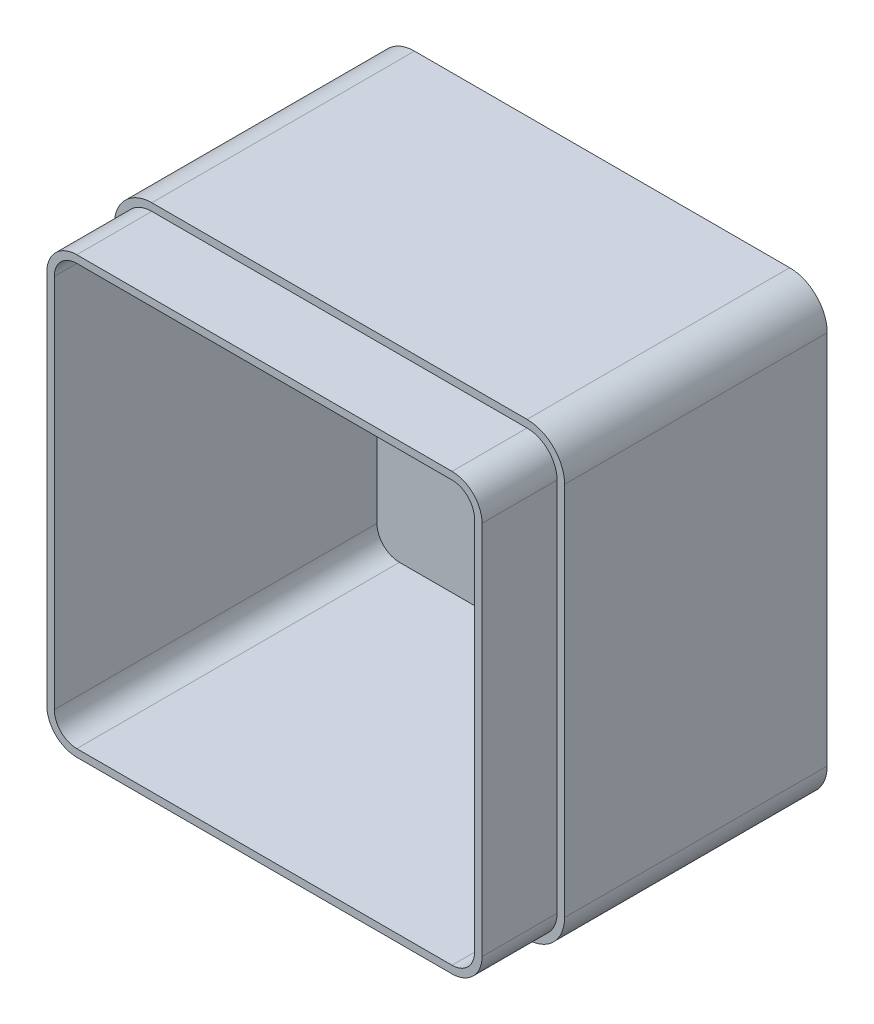
ISO-10303-21;
HEADER;
FILE_DESCRIPTION(('STEP AP214'),'2;1');
FILE_NAME('part.step','',(''),(''),'','','');
FILE_SCHEMA(('AUTOMOTIVE_DESIGN { 1 0 10303 214 1 1 1 1 }'));
ENDSEC;
DATA;
#1=APPLICATION_CONTEXT('core data for automotive mechanical design processes');
#2=APPLICATION_PROTOCOL_DEFINITION('international standard','automotive_design',2000,#1);
#3=PRODUCT_CONTEXT('',#1,'mechanical');
#4=PRODUCT('Part','Part','',(#3));
#5=PRODUCT_RELATED_PRODUCT_CATEGORY('part','',(#4));
#6=PRODUCT_DEFINITION_FORMATION('','',#4);
#7=PRODUCT_DEFINITION_CONTEXT('part definition',#1,'design');
#8=PRODUCT_DEFINITION('design','',#6,#7);
#9=PRODUCT_DEFINITION_SHAPE('','',#8);
#10=(LENGTH_UNIT() NAMED_UNIT(*) SI_UNIT(.MILLI.,.METRE.));
#11=(NAMED_UNIT(*) PLANE_ANGLE_UNIT() SI_UNIT($,.RADIAN.));
#12=(NAMED_UNIT(*) SI_UNIT($,.STERADIAN.) SOLID_ANGLE_UNIT());
#13=UNCERTAINTY_MEASURE_WITH_UNIT(LENGTH_MEASURE(1.E-05),#10,'distance_accuracy_value','');
#14=(GEOMETRIC_REPRESENTATION_CONTEXT(3) GLOBAL_UNCERTAINTY_ASSIGNED_CONTEXT((#13)) GLOBAL_UNIT_ASSIGNED_CONTEXT((#10,
#11,#12)) REPRESENTATION_CONTEXT('',''));
#15=CARTESIAN_POINT('',(0.,0.,0.));
#16=DIRECTION('',(0.,0.,1.));
#17=DIRECTION('',(1.,0.,0.));
#18=AXIS2_PLACEMENT_3D('',#15,#16,#17);
#19=CARTESIAN_POINT('',(0.,0.,90.));
#20=DIRECTION('',(0.,0.,-1.));
#21=DIRECTION('',(-1.,0.,0.));
#22=AXIS2_PLACEMENT_3D('',#19,#20,#21);
#23=PLANE('',#22);
#24=DIRECTION('',(0.,-1.,0.));
#25=VECTOR('',#24,1.);
#26=CARTESIAN_POINT('',(4.,0.,90.));
#27=LINE('',#26,#25);
#28=CARTESIAN_POINT('',(4.,110.,90.));
#29=VERTEX_POINT('',#28);
#30=CARTESIAN_POINT('',(4.,9.99999999999999,90.));
#31=VERTEX_POINT('',#30);
#32=EDGE_CURVE('E350',#29,#31,#27,.T.);
#33=ORIENTED_EDGE('',*,*,#32,.F.);
#34=CARTESIAN_POINT('',(10.,110.,90.));
#35=DIRECTION('',(0.,0.,-1.));
#36=DIRECTION('',(-1.,0.,0.));
#37=AXIS2_PLACEMENT_3D('',#34,#35,#36);
#38=CIRCLE('',#37,6.);
#39=CARTESIAN_POINT('',(9.99999999999999,116.,90.));
#40=VERTEX_POINT('',#39);
#41=EDGE_CURVE('E328',#40,#29,#38,.F.);
#42=ORIENTED_EDGE('',*,*,#41,.F.);
#43=DIRECTION('',(-1.,0.,0.));
#44=VECTOR('',#43,1.);
#45=CARTESIAN_POINT('',(0.,116.,90.));
#46=LINE('',#45,#44);
#47=CARTESIAN_POINT('',(110.,116.,90.));
#48=VERTEX_POINT('',#47);
#49=EDGE_CURVE('E364',#48,#40,#46,.T.);
#50=ORIENTED_EDGE('',*,*,#49,.F.);
#51=CARTESIAN_POINT('',(110.,110.,90.));
#52=DIRECTION('',(0.,0.,-1.));
#53=DIRECTION('',(-1.,0.,0.));
#54=AXIS2_PLACEMENT_3D('',#51,#52,#53);
#55=CIRCLE('',#54,6.);
#56=CARTESIAN_POINT('',(116.,110.,90.));
#57=VERTEX_POINT('',#56);
#58=EDGE_CURVE('E388',#57,#48,#55,.F.);
#59=ORIENTED_EDGE('',*,*,#58,.F.);
#60=DIRECTION('',(0.,1.,0.));
#61=VECTOR('',#60,1.);
#62=CARTESIAN_POINT('',(116.,0.,90.));
#63=LINE('',#62,#61);
#64=CARTESIAN_POINT('',(116.,9.99999999999999,90.));
#65=VERTEX_POINT('',#64);
#66=EDGE_CURVE('E392',#65,#57,#63,.T.);
#67=ORIENTED_EDGE('',*,*,#66,.F.);
#68=CARTESIAN_POINT('',(110.,10.,90.));
#69=DIRECTION('',(0.,0.,-1.));
#70=DIRECTION('',(-1.,0.,0.));
#71=AXIS2_PLACEMENT_3D('',#68,#69,#70);
#72=CIRCLE('',#71,6.);
#73=CARTESIAN_POINT('',(110.,4.,90.));
#74=VERTEX_POINT('',#73);
#75=EDGE_CURVE('E393',#74,#65,#72,.F.);
#76=ORIENTED_EDGE('',*,*,#75,.F.);
#77=DIRECTION('',(1.,0.,0.));
#78=VECTOR('',#77,1.);
#79=CARTESIAN_POINT('',(0.,4.,90.));
#80=LINE('',#79,#78);
#81=CARTESIAN_POINT('',(9.99999999999999,4.,90.));
#82=VERTEX_POINT('',#81);
#83=EDGE_CURVE('E385',#82,#74,#80,.T.);
#84=ORIENTED_EDGE('',*,*,#83,.F.);
#85=CARTESIAN_POINT('',(10.,10.,90.));
#86=DIRECTION('',(0.,0.,-1.));
#87=DIRECTION('',(-1.,0.,0.));
#88=AXIS2_PLACEMENT_3D('',#85,#86,#87);
#89=CIRCLE('',#88,6.);
#90=EDGE_CURVE('E381',#31,#82,#89,.F.);
#91=ORIENTED_EDGE('',*,*,#90,.F.);
#92=EDGE_LOOP('',(#33,#42,#50,#59,#67,#76,#84,#91));
#93=FACE_BOUND('',#92,.T.);
#94=CARTESIAN_POINT('',(10.,110.,90.));
#95=DIRECTION('',(0.,0.,1.));
#96=DIRECTION('',(1.,0.,0.));
#97=AXIS2_PLACEMENT_3D('',#94,#95,#96);
#98=CIRCLE('',#97,8.);
#99=CARTESIAN_POINT('',(9.99999999999999,118.,90.));
#100=VERTEX_POINT('',#99);
#101=CARTESIAN_POINT('',(2.,110.,90.));
#102=VERTEX_POINT('',#101);
#103=EDGE_CURVE('E256',#100,#102,#98,.T.);
#104=ORIENTED_EDGE('',*,*,#103,.T.);
#105=DIRECTION('',(0.,-1.,0.));
#106=VECTOR('',#105,1.);
#107=CARTESIAN_POINT('',(2.,110.,90.));
#108=LINE('',#107,#106);
#109=CARTESIAN_POINT('',(2.,9.99999999999999,90.));
#110=VERTEX_POINT('',#109);
#111=EDGE_CURVE('E206',#102,#110,#108,.T.);
#112=ORIENTED_EDGE('',*,*,#111,.T.);
#113=CARTESIAN_POINT('',(10.,10.,90.));
#114=DIRECTION('',(0.,0.,1.));
#115=DIRECTION('',(1.,0.,0.));
#116=AXIS2_PLACEMENT_3D('',#113,#114,#115);
#117=CIRCLE('',#116,8.);
#118=CARTESIAN_POINT('',(9.99999999999999,2.,90.));
#119=VERTEX_POINT('',#118);
#120=EDGE_CURVE('E55',#110,#119,#117,.T.);
#121=ORIENTED_EDGE('',*,*,#120,.T.);
#122=DIRECTION('',(1.,0.,0.));
#123=VECTOR('',#122,1.);
#124=CARTESIAN_POINT('',(10.,2.,90.));
#125=LINE('',#124,#123);
#126=CARTESIAN_POINT('',(110.,2.,90.));
#127=VERTEX_POINT('',#126);
#128=EDGE_CURVE('E263',#119,#127,#125,.T.);
#129=ORIENTED_EDGE('',*,*,#128,.T.);
#130=CARTESIAN_POINT('',(110.,10.,90.));
#131=DIRECTION('',(0.,0.,1.));
#132=DIRECTION('',(1.,0.,0.));
#133=AXIS2_PLACEMENT_3D('',#130,#131,#132);
#134=CIRCLE('',#133,7.99999999999999);
#135=CARTESIAN_POINT('',(118.,10.,90.));
#136=VERTEX_POINT('',#135);
#137=EDGE_CURVE('E267',#127,#136,#134,.T.);
#138=ORIENTED_EDGE('',*,*,#137,.T.);
#139=DIRECTION('',(0.,1.,0.));
#140=VECTOR('',#139,1.);
#141=CARTESIAN_POINT('',(118.,10.,90.));
#142=LINE('',#141,#140);
#143=CARTESIAN_POINT('',(118.,110.,90.));
#144=VERTEX_POINT('',#143);
#145=EDGE_CURVE('E271',#136,#144,#142,.T.);
#146=ORIENTED_EDGE('',*,*,#145,.T.);
#147=CARTESIAN_POINT('',(110.,110.,90.));
#148=DIRECTION('',(0.,0.,1.));
#149=DIRECTION('',(1.,0.,0.));
#150=AXIS2_PLACEMENT_3D('',#147,#148,#149);
#151=CIRCLE('',#150,7.99999999999999);
#152=CARTESIAN_POINT('',(110.,118.,90.));
#153=VERTEX_POINT('',#152);
#154=EDGE_CURVE('E233',#144,#153,#151,.T.);
#155=ORIENTED_EDGE('',*,*,#154,.T.);
#156=DIRECTION('',(-1.,0.,0.));
#157=VECTOR('',#156,1.);
#158=CARTESIAN_POINT('',(110.,118.,90.));
#159=LINE('',#158,#157);
#160=EDGE_CURVE('E229',#153,#100,#159,.T.);
#161=ORIENTED_EDGE('',*,*,#160,.T.);
#162=EDGE_LOOP('',(#104,#112,#121,#129,#138,#146,#155,#161));
#163=FACE_BOUND('',#162,.T.);
#164=ADVANCED_FACE('F39',(#93,#163),#23,.F.);
#165=CARTESIAN_POINT('',(4.,0.,90.));
#166=DIRECTION('',(1.,0.,0.));
#167=DIRECTION('',(0.,0.,-1.));
#168=AXIS2_PLACEMENT_3D('',#165,#166,#167);
#169=PLANE('',#168);
#170=DIRECTION('',(0.,-1.,0.));
#171=VECTOR('',#170,1.);
#172=CARTESIAN_POINT('',(4.,0.,4.));
#173=LINE('',#172,#171);
#174=CARTESIAN_POINT('',(4.,110.,4.));
#175=VERTEX_POINT('',#174);
#176=CARTESIAN_POINT('',(4.,9.99999999999999,4.));
#177=VERTEX_POINT('',#176);
#178=EDGE_CURVE('E320',#175,#177,#173,.T.);
#179=ORIENTED_EDGE('',*,*,#178,.F.);
#180=DIRECTION('',(0.,0.,-1.));
#181=VECTOR('',#180,1.);
#182=CARTESIAN_POINT('',(4.,110.,90.));
#183=LINE('',#182,#181);
#184=EDGE_CURVE('E329',#29,#175,#183,.T.);
#185=ORIENTED_EDGE('',*,*,#184,.F.);
#186=ORIENTED_EDGE('',*,*,#32,.T.);
#187=DIRECTION('',(0.,0.,-1.));
#188=VECTOR('',#187,1.);
#189=CARTESIAN_POINT('',(4.,9.99999999999999,90.));
#190=LINE('',#189,#188);
#191=EDGE_CURVE('E325',#177,#31,#190,.F.);
#192=ORIENTED_EDGE('',*,*,#191,.F.);
#193=EDGE_LOOP('',(#179,#185,#186,#192));
#194=FACE_BOUND('',#193,.T.);
#195=ADVANCED_FACE('F505',(#194),#169,.T.);
#196=CARTESIAN_POINT('',(0.,4.,90.));
#197=DIRECTION('',(0.,1.,0.));
#198=DIRECTION('',(0.,0.,1.));
#199=AXIS2_PLACEMENT_3D('',#196,#197,#198);
#200=PLANE('',#199);
#201=ORIENTED_EDGE('',*,*,#83,.T.);
#202=DIRECTION('',(0.,0.,1.));
#203=VECTOR('',#202,1.);
#204=CARTESIAN_POINT('',(110.,4.,90.));
#205=LINE('',#204,#203);
#206=CARTESIAN_POINT('',(110.,4.,4.));
#207=VERTEX_POINT('',#206);
#208=EDGE_CURVE('E361',#207,#74,#205,.T.);
#209=ORIENTED_EDGE('',*,*,#208,.F.);
#210=DIRECTION('',(1.,0.,0.));
#211=VECTOR('',#210,1.);
#212=CARTESIAN_POINT('',(0.,4.,4.));
#213=LINE('',#212,#211);
#214=CARTESIAN_POINT('',(9.99999999999999,4.,4.));
#215=VERTEX_POINT('',#214);
#216=EDGE_CURVE('E324',#215,#207,#213,.T.);
#217=ORIENTED_EDGE('',*,*,#216,.F.);
#218=DIRECTION('',(0.,0.,1.));
#219=VECTOR('',#218,1.);
#220=CARTESIAN_POINT('',(9.99999999999999,4.,90.));
#221=LINE('',#220,#219);
#222=EDGE_CURVE('E345',#82,#215,#221,.F.);
#223=ORIENTED_EDGE('',*,*,#222,.F.);
#224=EDGE_LOOP('',(#201,#209,#217,#223));
#225=FACE_BOUND('',#224,.T.);
#226=ADVANCED_FACE('F511',(#225),#200,.T.);
#227=CARTESIAN_POINT('',(116.,0.,90.));
#228=DIRECTION('',(-1.,0.,0.));
#229=DIRECTION('',(0.,0.,1.));
#230=AXIS2_PLACEMENT_3D('',#227,#228,#229);
#231=PLANE('',#230);
#232=DIRECTION('',(0.,1.,0.));
#233=VECTOR('',#232,1.);
#234=CARTESIAN_POINT('',(116.,0.,4.));
#235=LINE('',#234,#233);
#236=CARTESIAN_POINT('',(116.,9.99999999999999,4.));
#237=VERTEX_POINT('',#236);
#238=CARTESIAN_POINT('',(116.,110.,4.));
#239=VERTEX_POINT('',#238);
#240=EDGE_CURVE('E337',#237,#239,#235,.T.);
#241=ORIENTED_EDGE('',*,*,#240,.F.);
#242=DIRECTION('',(0.,0.,1.));
#243=VECTOR('',#242,1.);
#244=CARTESIAN_POINT('',(116.,9.99999999999999,90.));
#245=LINE('',#244,#243);
#246=EDGE_CURVE('E365',#65,#237,#245,.F.);
#247=ORIENTED_EDGE('',*,*,#246,.F.);
#248=ORIENTED_EDGE('',*,*,#66,.T.);
#249=DIRECTION('',(0.,0.,1.));
#250=VECTOR('',#249,1.);
#251=CARTESIAN_POINT('',(116.,110.,90.));
#252=LINE('',#251,#250);
#253=EDGE_CURVE('E369',#239,#57,#252,.T.);
#254=ORIENTED_EDGE('',*,*,#253,.F.);
#255=EDGE_LOOP('',(#241,#247,#248,#254));
#256=FACE_BOUND('',#255,.T.);
#257=ADVANCED_FACE('F540',(#256),#231,.T.);
#258=CARTESIAN_POINT('',(0.,116.,90.));
#259=DIRECTION('',(0.,-1.,0.));
#260=DIRECTION('',(0.,0.,-1.));
#261=AXIS2_PLACEMENT_3D('',#258,#259,#260);
#262=PLANE('',#261);
#263=ORIENTED_EDGE('',*,*,#49,.T.);
#264=DIRECTION('',(0.,0.,-1.));
#265=VECTOR('',#264,1.);
#266=CARTESIAN_POINT('',(9.99999999999999,116.,90.));
#267=LINE('',#266,#265);
#268=CARTESIAN_POINT('',(9.99999999999999,116.,4.));
#269=VERTEX_POINT('',#268);
#270=EDGE_CURVE('E377',#269,#40,#267,.F.);
#271=ORIENTED_EDGE('',*,*,#270,.F.);
#272=DIRECTION('',(-1.,0.,0.));
#273=VECTOR('',#272,1.);
#274=CARTESIAN_POINT('',(0.,116.,4.));
#275=LINE('',#274,#273);
#276=CARTESIAN_POINT('',(110.,116.,4.));
#277=VERTEX_POINT('',#276);
#278=EDGE_CURVE('E346',#277,#269,#275,.T.);
#279=ORIENTED_EDGE('',*,*,#278,.F.);
#280=DIRECTION('',(0.,0.,-1.));
#281=VECTOR('',#280,1.);
#282=CARTESIAN_POINT('',(110.,116.,90.));
#283=LINE('',#282,#281);
#284=EDGE_CURVE('E370',#48,#277,#283,.T.);
#285=ORIENTED_EDGE('',*,*,#284,.F.);
#286=EDGE_LOOP('',(#263,#271,#279,#285));
#287=FACE_BOUND('',#286,.T.);
#288=ADVANCED_FACE('F536',(#287),#262,.T.);
#289=CARTESIAN_POINT('',(0.,0.,4.));
#290=DIRECTION('',(0.,0.,-1.));
#291=DIRECTION('',(-1.,0.,0.));
#292=AXIS2_PLACEMENT_3D('',#289,#290,#291);
#293=PLANE('',#292);
#294=ORIENTED_EDGE('',*,*,#216,.T.);
#295=CARTESIAN_POINT('',(110.,10.,4.));
#296=DIRECTION('',(0.,0.,-1.));
#297=DIRECTION('',(-1.,0.,0.));
#298=AXIS2_PLACEMENT_3D('',#295,#296,#297);
#299=CIRCLE('',#298,6.);
#300=EDGE_CURVE('E344',#237,#207,#299,.T.);
#301=ORIENTED_EDGE('',*,*,#300,.F.);
#302=ORIENTED_EDGE('',*,*,#240,.T.);
#303=CARTESIAN_POINT('',(110.,110.,4.));
#304=DIRECTION('',(0.,0.,-1.));
#305=DIRECTION('',(-1.,0.,0.));
#306=AXIS2_PLACEMENT_3D('',#303,#304,#305);
#307=CIRCLE('',#306,6.);
#308=EDGE_CURVE('E340',#277,#239,#307,.T.);
#309=ORIENTED_EDGE('',*,*,#308,.F.);
#310=ORIENTED_EDGE('',*,*,#278,.T.);
#311=CARTESIAN_POINT('',(10.,110.,4.));
#312=DIRECTION('',(0.,0.,-1.));
#313=DIRECTION('',(-1.,0.,0.));
#314=AXIS2_PLACEMENT_3D('',#311,#312,#313);
#315=CIRCLE('',#314,6.);
#316=EDGE_CURVE('E341',#175,#269,#315,.T.);
#317=ORIENTED_EDGE('',*,*,#316,.F.);
#318=ORIENTED_EDGE('',*,*,#178,.T.);
#319=CARTESIAN_POINT('',(10.,10.,4.));
#320=DIRECTION('',(0.,0.,-1.));
#321=DIRECTION('',(-1.,0.,0.));
#322=AXIS2_PLACEMENT_3D('',#319,#320,#321);
#323=CIRCLE('',#322,6.);
#324=EDGE_CURVE('E333',#215,#177,#323,.T.);
#325=ORIENTED_EDGE('',*,*,#324,.F.);
#326=EDGE_LOOP('',(#294,#301,#302,#309,#310,#317,#318,#325));
#327=FACE_BOUND('',#326,.T.);
#328=ADVANCED_FACE('F532',(#327),#293,.F.);
#329=CARTESIAN_POINT('',(10.,10.,90.));
#330=DIRECTION('',(0.,0.,-1.));
#331=DIRECTION('',(-1.,0.,0.));
#332=AXIS2_PLACEMENT_3D('',#329,#330,#331);
#333=CYLINDRICAL_SURFACE('',#332,6.);
#334=ORIENTED_EDGE('',*,*,#90,.T.);
#335=ORIENTED_EDGE('',*,*,#222,.T.);
#336=ORIENTED_EDGE('',*,*,#324,.T.);
#337=ORIENTED_EDGE('',*,*,#191,.T.);
#338=EDGE_LOOP('',(#334,#335,#336,#337));
#339=FACE_BOUND('',#338,.T.);
#340=ADVANCED_FACE('F528',(#339),#333,.F.);
#341=CARTESIAN_POINT('',(110.,110.,90.));
#342=DIRECTION('',(0.,0.,-1.));
#343=DIRECTION('',(-1.,0.,0.));
#344=AXIS2_PLACEMENT_3D('',#341,#342,#343);
#345=CYLINDRICAL_SURFACE('',#344,6.);
#346=ORIENTED_EDGE('',*,*,#58,.T.);
#347=ORIENTED_EDGE('',*,*,#284,.T.);
#348=ORIENTED_EDGE('',*,*,#308,.T.);
#349=ORIENTED_EDGE('',*,*,#253,.T.);
#350=EDGE_LOOP('',(#346,#347,#348,#349));
#351=FACE_BOUND('',#350,.T.);
#352=ADVANCED_FACE('F524',(#351),#345,.F.);
#353=CARTESIAN_POINT('',(110.,10.,90.));
#354=DIRECTION('',(0.,0.,-1.));
#355=DIRECTION('',(-1.,0.,0.));
#356=AXIS2_PLACEMENT_3D('',#353,#354,#355);
#357=CYLINDRICAL_SURFACE('',#356,6.);
#358=ORIENTED_EDGE('',*,*,#75,.T.);
#359=ORIENTED_EDGE('',*,*,#246,.T.);
#360=ORIENTED_EDGE('',*,*,#300,.T.);
#361=ORIENTED_EDGE('',*,*,#208,.T.);
#362=EDGE_LOOP('',(#358,#359,#360,#361));
#363=FACE_BOUND('',#362,.T.);
#364=ADVANCED_FACE('F520',(#363),#357,.F.);
#365=CARTESIAN_POINT('',(10.,110.,90.));
#366=DIRECTION('',(0.,0.,-1.));
#367=DIRECTION('',(-1.,0.,0.));
#368=AXIS2_PLACEMENT_3D('',#365,#366,#367);
#369=CYLINDRICAL_SURFACE('',#368,6.);
#370=ORIENTED_EDGE('',*,*,#41,.T.);
#371=ORIENTED_EDGE('',*,*,#184,.T.);
#372=ORIENTED_EDGE('',*,*,#316,.T.);
#373=ORIENTED_EDGE('',*,*,#270,.T.);
#374=EDGE_LOOP('',(#370,#371,#372,#373));
#375=FACE_BOUND('',#374,.T.);
#376=ADVANCED_FACE('F517',(#375),#369,.F.);
#377=CARTESIAN_POINT('',(60.,60.,70.));
#378=DIRECTION('',(0.,0.,1.));
#379=DIRECTION('',(1.,0.,0.));
#380=AXIS2_PLACEMENT_3D('',#377,#378,#379);
#381=PLANE('',#380);
#382=DIRECTION('',(0.,1.,0.));
#383=VECTOR('',#382,1.);
#384=CARTESIAN_POINT('',(120.,0.,70.));
#385=LINE('',#384,#383);
#386=CARTESIAN_POINT('',(120.,10.,70.));
#387=VERTEX_POINT('',#386);
#388=CARTESIAN_POINT('',(120.,110.,70.));
#389=VERTEX_POINT('',#388);
#390=EDGE_CURVE('E310',#387,#389,#385,.T.);
#391=ORIENTED_EDGE('',*,*,#390,.T.);
#392=CARTESIAN_POINT('',(110.,110.,70.));
#393=DIRECTION('',(0.,0.,1.));
#394=DIRECTION('',(1.,0.,0.));
#395=AXIS2_PLACEMENT_3D('',#392,#393,#394);
#396=CIRCLE('',#395,10.);
#397=CARTESIAN_POINT('',(110.,120.,70.));
#398=VERTEX_POINT('',#397);
#399=EDGE_CURVE('E302',#398,#389,#396,.F.);
#400=ORIENTED_EDGE('',*,*,#399,.F.);
#401=DIRECTION('',(-1.,0.,0.));
#402=VECTOR('',#401,1.);
#403=CARTESIAN_POINT('',(0.,120.,70.));
#404=LINE('',#403,#402);
#405=CARTESIAN_POINT('',(10.,120.,70.));
#406=VERTEX_POINT('',#405);
#407=EDGE_CURVE('E63',#398,#406,#404,.T.);
#408=ORIENTED_EDGE('',*,*,#407,.T.);
#409=CARTESIAN_POINT('',(10.,110.,70.));
#410=DIRECTION('',(0.,0.,1.));
#411=DIRECTION('',(1.,0.,0.));
#412=AXIS2_PLACEMENT_3D('',#409,#410,#411);
#413=CIRCLE('',#412,10.);
#414=CARTESIAN_POINT('',(0.,110.,70.));
#415=VERTEX_POINT('',#414);
#416=EDGE_CURVE('E12',#415,#406,#413,.F.);
#417=ORIENTED_EDGE('',*,*,#416,.F.);
#418=DIRECTION('',(0.,-1.,0.));
#419=VECTOR('',#418,1.);
#420=CARTESIAN_POINT('',(0.,0.,70.));
#421=LINE('',#420,#419);
#422=CARTESIAN_POINT('',(0.,10.,70.));
#423=VERTEX_POINT('',#422);
#424=EDGE_CURVE('E299',#415,#423,#421,.T.);
#425=ORIENTED_EDGE('',*,*,#424,.T.);
#426=CARTESIAN_POINT('',(10.,10.,70.));
#427=DIRECTION('',(0.,0.,1.));
#428=DIRECTION('',(1.,0.,0.));
#429=AXIS2_PLACEMENT_3D('',#426,#427,#428);
#430=CIRCLE('',#429,10.);
#431=CARTESIAN_POINT('',(10.,0.,70.));
#432=VERTEX_POINT('',#431);
#433=EDGE_CURVE('E306',#432,#423,#430,.F.);
#434=ORIENTED_EDGE('',*,*,#433,.F.);
#435=DIRECTION('',(1.,0.,0.));
#436=VECTOR('',#435,1.);
#437=CARTESIAN_POINT('',(0.,0.,70.));
#438=LINE('',#437,#436);
#439=CARTESIAN_POINT('',(110.,0.,70.));
#440=VERTEX_POINT('',#439);
#441=EDGE_CURVE('E313',#432,#440,#438,.T.);
#442=ORIENTED_EDGE('',*,*,#441,.T.);
#443=CARTESIAN_POINT('',(110.,10.,70.));
#444=DIRECTION('',(0.,0.,1.));
#445=DIRECTION('',(1.,0.,0.));
#446=AXIS2_PLACEMENT_3D('',#443,#444,#445);
#447=CIRCLE('',#446,10.);
#448=EDGE_CURVE('E316',#387,#440,#447,.F.);
#449=ORIENTED_EDGE('',*,*,#448,.F.);
#450=EDGE_LOOP('',(#391,#400,#408,#417,#425,#434,#442,#449));
#451=FACE_BOUND('',#450,.T.);
#452=DIRECTION('',(-1.,0.,0.));
#453=VECTOR('',#452,1.);
#454=CARTESIAN_POINT('',(110.,118.,70.));
#455=LINE('',#454,#453);
#456=CARTESIAN_POINT('',(110.,118.,70.));
#457=VERTEX_POINT('',#456);
#458=CARTESIAN_POINT('',(9.99999999999999,118.,70.));
#459=VERTEX_POINT('',#458);
#460=EDGE_CURVE('E213',#457,#459,#455,.T.);
#461=ORIENTED_EDGE('',*,*,#460,.F.);
#462=CARTESIAN_POINT('',(110.,110.,70.));
#463=DIRECTION('',(0.,0.,1.));
#464=DIRECTION('',(1.,0.,0.));
#465=AXIS2_PLACEMENT_3D('',#462,#463,#464);
#466=CIRCLE('',#465,7.99999999999999);
#467=CARTESIAN_POINT('',(118.,110.,70.));
#468=VERTEX_POINT('',#467);
#469=EDGE_CURVE('E250',#468,#457,#466,.T.);
#470=ORIENTED_EDGE('',*,*,#469,.F.);
#471=DIRECTION('',(0.,1.,0.));
#472=VECTOR('',#471,1.);
#473=CARTESIAN_POINT('',(118.,10.,70.));
#474=LINE('',#473,#472);
#475=CARTESIAN_POINT('',(118.,10.,70.));
#476=VERTEX_POINT('',#475);
#477=EDGE_CURVE('E246',#476,#468,#474,.T.);
#478=ORIENTED_EDGE('',*,*,#477,.F.);
#479=CARTESIAN_POINT('',(110.,10.,70.));
#480=DIRECTION('',(0.,0.,1.));
#481=DIRECTION('',(1.,0.,0.));
#482=AXIS2_PLACEMENT_3D('',#479,#480,#481);
#483=CIRCLE('',#482,7.99999999999999);
#484=CARTESIAN_POINT('',(110.,2.,70.));
#485=VERTEX_POINT('',#484);
#486=EDGE_CURVE('E242',#485,#476,#483,.T.);
#487=ORIENTED_EDGE('',*,*,#486,.F.);
#488=DIRECTION('',(1.,0.,0.));
#489=VECTOR('',#488,1.);
#490=CARTESIAN_POINT('',(10.,2.,70.));
#491=LINE('',#490,#489);
#492=CARTESIAN_POINT('',(9.99999999999999,2.,70.));
#493=VERTEX_POINT('',#492);
#494=EDGE_CURVE('E238',#493,#485,#491,.T.);
#495=ORIENTED_EDGE('',*,*,#494,.F.);
#496=CARTESIAN_POINT('',(10.,10.,70.));
#497=DIRECTION('',(0.,0.,1.));
#498=DIRECTION('',(1.,0.,0.));
#499=AXIS2_PLACEMENT_3D('',#496,#497,#498);
#500=CIRCLE('',#499,8.);
#501=CARTESIAN_POINT('',(2.,9.99999999999999,70.));
#502=VERTEX_POINT('',#501);
#503=EDGE_CURVE('E223',#502,#493,#500,.T.);
#504=ORIENTED_EDGE('',*,*,#503,.F.);
#505=DIRECTION('',(0.,-1.,0.));
#506=VECTOR('',#505,1.);
#507=CARTESIAN_POINT('',(2.,110.,70.));
#508=LINE('',#507,#506);
#509=CARTESIAN_POINT('',(2.,110.,70.));
#510=VERTEX_POINT('',#509);
#511=EDGE_CURVE('E204',#510,#502,#508,.T.);
#512=ORIENTED_EDGE('',*,*,#511,.F.);
#513=CARTESIAN_POINT('',(10.,110.,70.));
#514=DIRECTION('',(0.,0.,1.));
#515=DIRECTION('',(1.,0.,0.));
#516=AXIS2_PLACEMENT_3D('',#513,#514,#515);
#517=CIRCLE('',#516,8.);
#518=EDGE_CURVE('E219',#459,#510,#517,.T.);
#519=ORIENTED_EDGE('',*,*,#518,.F.);
#520=EDGE_LOOP('',(#461,#470,#478,#487,#495,#504,#512,#519));
#521=FACE_BOUND('',#520,.T.);
#522=ADVANCED_FACE('F218',(#451,#521),#381,.T.);
#523=CARTESIAN_POINT('',(10.,110.,70.));
#524=DIRECTION('',(0.,0.,1.));
#525=DIRECTION('',(1.,0.,0.));
#526=AXIS2_PLACEMENT_3D('',#523,#524,#525);
#527=CYLINDRICAL_SURFACE('',#526,8.);
#528=ORIENTED_EDGE('',*,*,#103,.F.);
#529=DIRECTION('',(0.,0.,1.));
#530=VECTOR('',#529,1.);
#531=CARTESIAN_POINT('',(9.99999999999999,118.,70.));
#532=LINE('',#531,#530);
#533=EDGE_CURVE('E227',#459,#100,#532,.T.);
#534=ORIENTED_EDGE('',*,*,#533,.F.);
#535=ORIENTED_EDGE('',*,*,#518,.T.);
#536=DIRECTION('',(0.,0.,1.));
#537=VECTOR('',#536,1.);
#538=CARTESIAN_POINT('',(2.,110.,70.));
#539=LINE('',#538,#537);
#540=EDGE_CURVE('E201',#510,#102,#539,.T.);
#541=ORIENTED_EDGE('',*,*,#540,.T.);
#542=EDGE_LOOP('',(#528,#534,#535,#541));
#543=FACE_BOUND('',#542,.T.);
#544=ADVANCED_FACE('F226',(#543),#527,.T.);
#545=CARTESIAN_POINT('',(110.,118.,70.));
#546=DIRECTION('',(0.,1.,0.));
#547=DIRECTION('',(0.,0.,1.));
#548=AXIS2_PLACEMENT_3D('',#545,#546,#547);
#549=PLANE('',#548);
#550=ORIENTED_EDGE('',*,*,#160,.F.);
#551=DIRECTION('',(0.,0.,1.));
#552=VECTOR('',#551,1.);
#553=CARTESIAN_POINT('',(110.,118.,70.));
#554=LINE('',#553,#552);
#555=EDGE_CURVE('E280',#457,#153,#554,.T.);
#556=ORIENTED_EDGE('',*,*,#555,.F.);
#557=ORIENTED_EDGE('',*,*,#460,.T.);
#558=ORIENTED_EDGE('',*,*,#533,.T.);
#559=EDGE_LOOP('',(#550,#556,#557,#558));
#560=FACE_BOUND('',#559,.T.);
#561=ADVANCED_FACE('F551',(#560),#549,.T.);
#562=CARTESIAN_POINT('',(110.,110.,70.));
#563=DIRECTION('',(0.,0.,1.));
#564=DIRECTION('',(1.,0.,0.));
#565=AXIS2_PLACEMENT_3D('',#562,#563,#564);
#566=CYLINDRICAL_SURFACE('',#565,7.99999999999999);
#567=ORIENTED_EDGE('',*,*,#154,.F.);
#568=DIRECTION('',(0.,0.,1.));
#569=VECTOR('',#568,1.);
#570=CARTESIAN_POINT('',(118.,110.,70.));
#571=LINE('',#570,#569);
#572=EDGE_CURVE('E283',#468,#144,#571,.T.);
#573=ORIENTED_EDGE('',*,*,#572,.F.);
#574=ORIENTED_EDGE('',*,*,#469,.T.);
#575=ORIENTED_EDGE('',*,*,#555,.T.);
#576=EDGE_LOOP('',(#567,#573,#574,#575));
#577=FACE_BOUND('',#576,.T.);
#578=ADVANCED_FACE('F566',(#577),#566,.T.);
#579=CARTESIAN_POINT('',(118.,10.,70.));
#580=DIRECTION('',(1.,0.,0.));
#581=DIRECTION('',(0.,0.,-1.));
#582=AXIS2_PLACEMENT_3D('',#579,#580,#581);
#583=PLANE('',#582);
#584=ORIENTED_EDGE('',*,*,#145,.F.);
#585=DIRECTION('',(0.,0.,1.));
#586=VECTOR('',#585,1.);
#587=CARTESIAN_POINT('',(118.,10.,70.));
#588=LINE('',#587,#586);
#589=EDGE_CURVE('E286',#476,#136,#588,.T.);
#590=ORIENTED_EDGE('',*,*,#589,.F.);
#591=ORIENTED_EDGE('',*,*,#477,.T.);
#592=ORIENTED_EDGE('',*,*,#572,.T.);
#593=EDGE_LOOP('',(#584,#590,#591,#592));
#594=FACE_BOUND('',#593,.T.);
#595=ADVANCED_FACE('F562',(#594),#583,.T.);
#596=CARTESIAN_POINT('',(110.,10.,70.));
#597=DIRECTION('',(0.,0.,1.));
#598=DIRECTION('',(1.,0.,0.));
#599=AXIS2_PLACEMENT_3D('',#596,#597,#598);
#600=CYLINDRICAL_SURFACE('',#599,7.99999999999999);
#601=ORIENTED_EDGE('',*,*,#137,.F.);
#602=DIRECTION('',(0.,0.,1.));
#603=VECTOR('',#602,1.);
#604=CARTESIAN_POINT('',(110.,2.,70.));
#605=LINE('',#604,#603);
#606=EDGE_CURVE('E289',#485,#127,#605,.T.);
#607=ORIENTED_EDGE('',*,*,#606,.F.);
#608=ORIENTED_EDGE('',*,*,#486,.T.);
#609=ORIENTED_EDGE('',*,*,#589,.T.);
#610=EDGE_LOOP('',(#601,#607,#608,#609));
#611=FACE_BOUND('',#610,.T.);
#612=ADVANCED_FACE('F558',(#611),#600,.T.);
#613=CARTESIAN_POINT('',(10.,2.,70.));
#614=DIRECTION('',(0.,-1.,0.));
#615=DIRECTION('',(0.,0.,-1.));
#616=AXIS2_PLACEMENT_3D('',#613,#614,#615);
#617=PLANE('',#616);
#618=ORIENTED_EDGE('',*,*,#128,.F.);
#619=DIRECTION('',(0.,0.,1.));
#620=VECTOR('',#619,1.);
#621=CARTESIAN_POINT('',(9.99999999999999,2.,70.));
#622=LINE('',#621,#620);
#623=EDGE_CURVE('E292',#493,#119,#622,.T.);
#624=ORIENTED_EDGE('',*,*,#623,.F.);
#625=ORIENTED_EDGE('',*,*,#494,.T.);
#626=ORIENTED_EDGE('',*,*,#606,.T.);
#627=EDGE_LOOP('',(#618,#624,#625,#626));
#628=FACE_BOUND('',#627,.T.);
#629=ADVANCED_FACE('F555',(#628),#617,.T.);
#630=CARTESIAN_POINT('',(10.,10.,70.));
#631=DIRECTION('',(0.,0.,1.));
#632=DIRECTION('',(1.,0.,0.));
#633=AXIS2_PLACEMENT_3D('',#630,#631,#632);
#634=CYLINDRICAL_SURFACE('',#633,8.);
#635=ORIENTED_EDGE('',*,*,#120,.F.);
#636=DIRECTION('',(0.,0.,1.));
#637=VECTOR('',#636,1.);
#638=CARTESIAN_POINT('',(2.,9.99999999999999,70.));
#639=LINE('',#638,#637);
#640=EDGE_CURVE('E212',#502,#110,#639,.T.);
#641=ORIENTED_EDGE('',*,*,#640,.F.);
#642=ORIENTED_EDGE('',*,*,#503,.T.);
#643=ORIENTED_EDGE('',*,*,#623,.T.);
#644=EDGE_LOOP('',(#635,#641,#642,#643));
#645=FACE_BOUND('',#644,.T.);
#646=ADVANCED_FACE('F500',(#645),#634,.T.);
#647=CARTESIAN_POINT('',(2.,110.,70.));
#648=DIRECTION('',(-1.,0.,0.));
#649=DIRECTION('',(0.,0.,1.));
#650=AXIS2_PLACEMENT_3D('',#647,#648,#649);
#651=PLANE('',#650);
#652=ORIENTED_EDGE('',*,*,#111,.F.);
#653=ORIENTED_EDGE('',*,*,#540,.F.);
#654=ORIENTED_EDGE('',*,*,#511,.T.);
#655=ORIENTED_EDGE('',*,*,#640,.T.);
#656=EDGE_LOOP('',(#652,#653,#654,#655));
#657=FACE_BOUND('',#656,.T.);
#658=ADVANCED_FACE('F203',(#657),#651,.T.);
#659=CARTESIAN_POINT('',(0.,0.,0.));
#660=DIRECTION('',(0.,0.,-1.));
#661=DIRECTION('',(-1.,0.,0.));
#662=AXIS2_PLACEMENT_3D('',#659,#660,#661);
#663=PLANE('',#662);
#664=DIRECTION('',(1.,0.,0.));
#665=VECTOR('',#664,1.);
#666=CARTESIAN_POINT('',(0.,0.,0.));
#667=LINE('',#666,#665);
#668=CARTESIAN_POINT('',(10.,0.,0.));
#669=VERTEX_POINT('',#668);
#670=CARTESIAN_POINT('',(110.,0.,0.));
#671=VERTEX_POINT('',#670);
#672=EDGE_CURVE('E408',#669,#671,#667,.T.);
#673=ORIENTED_EDGE('',*,*,#672,.F.);
#674=CARTESIAN_POINT('',(10.,10.,0.));
#675=DIRECTION('',(0.,0.,-1.));
#676=DIRECTION('',(-1.,0.,0.));
#677=AXIS2_PLACEMENT_3D('',#674,#675,#676);
#678=CIRCLE('',#677,10.);
#679=CARTESIAN_POINT('',(0.,10.,0.));
#680=VERTEX_POINT('',#679);
#681=EDGE_CURVE('E436',#669,#680,#678,.T.);
#682=ORIENTED_EDGE('',*,*,#681,.T.);
#683=DIRECTION('',(0.,-1.,0.));
#684=VECTOR('',#683,1.);
#685=CARTESIAN_POINT('',(0.,0.,0.));
#686=LINE('',#685,#684);
#687=CARTESIAN_POINT('',(0.,110.,0.));
#688=VERTEX_POINT('',#687);
#689=EDGE_CURVE('E373',#688,#680,#686,.T.);
#690=ORIENTED_EDGE('',*,*,#689,.F.);
#691=CARTESIAN_POINT('',(10.,110.,0.));
#692=DIRECTION('',(0.,0.,-1.));
#693=DIRECTION('',(-1.,0.,0.));
#694=AXIS2_PLACEMENT_3D('',#691,#692,#693);
#695=CIRCLE('',#694,10.);
#696=CARTESIAN_POINT('',(10.,120.,0.));
#697=VERTEX_POINT('',#696);
#698=EDGE_CURVE('E427',#688,#697,#695,.T.);
#699=ORIENTED_EDGE('',*,*,#698,.T.);
#700=DIRECTION('',(-1.,0.,0.));
#701=VECTOR('',#700,1.);
#702=CARTESIAN_POINT('',(0.,120.,0.));
#703=LINE('',#702,#701);
#704=CARTESIAN_POINT('',(110.,120.,0.));
#705=VERTEX_POINT('',#704);
#706=EDGE_CURVE('E416',#705,#697,#703,.T.);
#707=ORIENTED_EDGE('',*,*,#706,.F.);
#708=CARTESIAN_POINT('',(110.,110.,0.));
#709=DIRECTION('',(0.,0.,-1.));
#710=DIRECTION('',(-1.,0.,0.));
#711=AXIS2_PLACEMENT_3D('',#708,#709,#710);
#712=CIRCLE('',#711,10.);
#713=CARTESIAN_POINT('',(120.,110.,0.));
#714=VERTEX_POINT('',#713);
#715=EDGE_CURVE('E433',#705,#714,#712,.T.);
#716=ORIENTED_EDGE('',*,*,#715,.T.);
#717=DIRECTION('',(0.,1.,0.));
#718=VECTOR('',#717,1.);
#719=CARTESIAN_POINT('',(120.,0.,0.));
#720=LINE('',#719,#718);
#721=CARTESIAN_POINT('',(120.,10.,0.));
#722=VERTEX_POINT('',#721);
#723=EDGE_CURVE('E412',#722,#714,#720,.T.);
#724=ORIENTED_EDGE('',*,*,#723,.F.);
#725=CARTESIAN_POINT('',(110.,10.,0.));
#726=DIRECTION('',(0.,0.,-1.));
#727=DIRECTION('',(-1.,0.,0.));
#728=AXIS2_PLACEMENT_3D('',#725,#726,#727);
#729=CIRCLE('',#728,10.);
#730=EDGE_CURVE('E430',#722,#671,#729,.T.);
#731=ORIENTED_EDGE('',*,*,#730,.T.);
#732=EDGE_LOOP('',(#673,#682,#690,#699,#707,#716,#724,#731));
#733=FACE_BOUND('',#732,.T.);
#734=ADVANCED_FACE('F492',(#733),#663,.T.);
#735=CARTESIAN_POINT('',(10.,110.,90.));
#736=DIRECTION('',(0.,0.,-1.));
#737=DIRECTION('',(-1.,0.,0.));
#738=AXIS2_PLACEMENT_3D('',#735,#736,#737);
#739=CYLINDRICAL_SURFACE('',#738,10.);
#740=DIRECTION('',(0.,0.,-1.));
#741=VECTOR('',#740,1.);
#742=CARTESIAN_POINT('',(0.,110.,90.));
#743=LINE('',#742,#741);
#744=EDGE_CURVE('E439',#415,#688,#743,.T.);
#745=ORIENTED_EDGE('',*,*,#744,.F.);
#746=ORIENTED_EDGE('',*,*,#416,.T.);
#747=DIRECTION('',(0.,0.,-1.));
#748=VECTOR('',#747,1.);
#749=CARTESIAN_POINT('',(10.,120.,90.));
#750=LINE('',#749,#748);
#751=EDGE_CURVE('E446',#697,#406,#750,.F.);
#752=ORIENTED_EDGE('',*,*,#751,.F.);
#753=ORIENTED_EDGE('',*,*,#698,.F.);
#754=EDGE_LOOP('',(#745,#746,#752,#753));
#755=FACE_BOUND('',#754,.T.);
#756=ADVANCED_FACE('F41',(#755),#739,.T.);
#757=CARTESIAN_POINT('',(110.,110.,90.));
#758=DIRECTION('',(0.,0.,-1.));
#759=DIRECTION('',(-1.,0.,0.));
#760=AXIS2_PLACEMENT_3D('',#757,#758,#759);
#761=CYLINDRICAL_SURFACE('',#760,10.);
#762=DIRECTION('',(0.,0.,-1.));
#763=VECTOR('',#762,1.);
#764=CARTESIAN_POINT('',(110.,120.,90.));
#765=LINE('',#764,#763);
#766=EDGE_CURVE('E450',#398,#705,#765,.T.);
#767=ORIENTED_EDGE('',*,*,#766,.F.);
#768=ORIENTED_EDGE('',*,*,#399,.T.);
#769=DIRECTION('',(0.,0.,-1.));
#770=VECTOR('',#769,1.);
#771=CARTESIAN_POINT('',(120.,110.,90.));
#772=LINE('',#771,#770);
#773=EDGE_CURVE('E48',#714,#389,#772,.F.);
#774=ORIENTED_EDGE('',*,*,#773,.F.);
#775=ORIENTED_EDGE('',*,*,#715,.F.);
#776=EDGE_LOOP('',(#767,#768,#774,#775));
#777=FACE_BOUND('',#776,.T.);
#778=ADVANCED_FACE('F466',(#777),#761,.T.);
#779=CARTESIAN_POINT('',(0.,120.,90.));
#780=DIRECTION('',(0.,-1.,0.));
#781=DIRECTION('',(0.,0.,-1.));
#782=AXIS2_PLACEMENT_3D('',#779,#780,#781);
#783=PLANE('',#782);
#784=ORIENTED_EDGE('',*,*,#407,.F.);
#785=ORIENTED_EDGE('',*,*,#766,.T.);
#786=ORIENTED_EDGE('',*,*,#706,.T.);
#787=ORIENTED_EDGE('',*,*,#751,.T.);
#788=EDGE_LOOP('',(#784,#785,#786,#787));
#789=FACE_BOUND('',#788,.T.);
#790=ADVANCED_FACE('F469',(#789),#783,.F.);
#791=CARTESIAN_POINT('',(110.,10.,90.));
#792=DIRECTION('',(0.,0.,-1.));
#793=DIRECTION('',(-1.,0.,0.));
#794=AXIS2_PLACEMENT_3D('',#791,#792,#793);
#795=CYLINDRICAL_SURFACE('',#794,10.);
#796=DIRECTION('',(0.,0.,-1.));
#797=VECTOR('',#796,1.);
#798=CARTESIAN_POINT('',(120.,10.,90.));
#799=LINE('',#798,#797);
#800=EDGE_CURVE('E453',#387,#722,#799,.T.);
#801=ORIENTED_EDGE('',*,*,#800,.F.);
#802=ORIENTED_EDGE('',*,*,#448,.T.);
#803=DIRECTION('',(0.,0.,-1.));
#804=VECTOR('',#803,1.);
#805=CARTESIAN_POINT('',(110.,0.,90.));
#806=LINE('',#805,#804);
#807=EDGE_CURVE('E420',#671,#440,#806,.F.);
#808=ORIENTED_EDGE('',*,*,#807,.F.);
#809=ORIENTED_EDGE('',*,*,#730,.F.);
#810=EDGE_LOOP('',(#801,#802,#808,#809));
#811=FACE_BOUND('',#810,.T.);
#812=ADVANCED_FACE('F490',(#811),#795,.T.);
#813=CARTESIAN_POINT('',(120.,0.,90.));
#814=DIRECTION('',(-1.,0.,0.));
#815=DIRECTION('',(0.,0.,1.));
#816=AXIS2_PLACEMENT_3D('',#813,#814,#815);
#817=PLANE('',#816);
#818=ORIENTED_EDGE('',*,*,#390,.F.);
#819=ORIENTED_EDGE('',*,*,#800,.T.);
#820=ORIENTED_EDGE('',*,*,#723,.T.);
#821=ORIENTED_EDGE('',*,*,#773,.T.);
#822=EDGE_LOOP('',(#818,#819,#820,#821));
#823=FACE_BOUND('',#822,.T.);
#824=ADVANCED_FACE('F460',(#823),#817,.F.);
#825=CARTESIAN_POINT('',(10.,10.,90.));
#826=DIRECTION('',(0.,0.,-1.));
#827=DIRECTION('',(-1.,0.,0.));
#828=AXIS2_PLACEMENT_3D('',#825,#826,#827);
#829=CYLINDRICAL_SURFACE('',#828,10.);
#830=DIRECTION('',(0.,0.,-1.));
#831=VECTOR('',#830,1.);
#832=CARTESIAN_POINT('',(10.,0.,90.));
#833=LINE('',#832,#831);
#834=EDGE_CURVE('E424',#432,#669,#833,.T.);
#835=ORIENTED_EDGE('',*,*,#834,.F.);
#836=ORIENTED_EDGE('',*,*,#433,.T.);
#837=DIRECTION('',(0.,0.,-1.));
#838=VECTOR('',#837,1.);
#839=CARTESIAN_POINT('',(0.,10.,90.));
#840=LINE('',#839,#838);
#841=EDGE_CURVE('E442',#680,#423,#840,.F.);
#842=ORIENTED_EDGE('',*,*,#841,.F.);
#843=ORIENTED_EDGE('',*,*,#681,.F.);
#844=EDGE_LOOP('',(#835,#836,#842,#843));
#845=FACE_BOUND('',#844,.T.);
#846=ADVANCED_FACE('F482',(#845),#829,.T.);
#847=CARTESIAN_POINT('',(0.,0.,90.));
#848=DIRECTION('',(0.,1.,0.));
#849=DIRECTION('',(0.,0.,1.));
#850=AXIS2_PLACEMENT_3D('',#847,#848,#849);
#851=PLANE('',#850);
#852=ORIENTED_EDGE('',*,*,#441,.F.);
#853=ORIENTED_EDGE('',*,*,#834,.T.);
#854=ORIENTED_EDGE('',*,*,#672,.T.);
#855=ORIENTED_EDGE('',*,*,#807,.T.);
#856=EDGE_LOOP('',(#852,#853,#854,#855));
#857=FACE_BOUND('',#856,.T.);
#858=ADVANCED_FACE('F486',(#857),#851,.F.);
#859=CARTESIAN_POINT('',(0.,0.,90.));
#860=DIRECTION('',(1.,0.,0.));
#861=DIRECTION('',(0.,0.,-1.));
#862=AXIS2_PLACEMENT_3D('',#859,#860,#861);
#863=PLANE('',#862);
#864=ORIENTED_EDGE('',*,*,#424,.F.);
#865=ORIENTED_EDGE('',*,*,#744,.T.);
#866=ORIENTED_EDGE('',*,*,#689,.T.);
#867=ORIENTED_EDGE('',*,*,#841,.T.);
#868=EDGE_LOOP('',(#864,#865,#866,#867));
#869=FACE_BOUND('',#868,.T.);
#870=ADVANCED_FACE('F477',(#869),#863,.F.);
#871=CLOSED_SHELL('',(#164,#195,#226,#257,#288,#328,#340,#352,#364,#376,#522,#544,#561,#578,
#595,#612,#629,#646,#658,#734,#756,#778,#790,#812,#824,#846,#858,#870));
#872=MANIFOLD_SOLID_BREP('B2',#871);
#873=ADVANCED_BREP_SHAPE_REPRESENTATION('',(#18,#872),#14);
#874=SHAPE_DEFINITION_REPRESENTATION(#9,#873);
ENDSEC;
END-ISO-10303-21;
